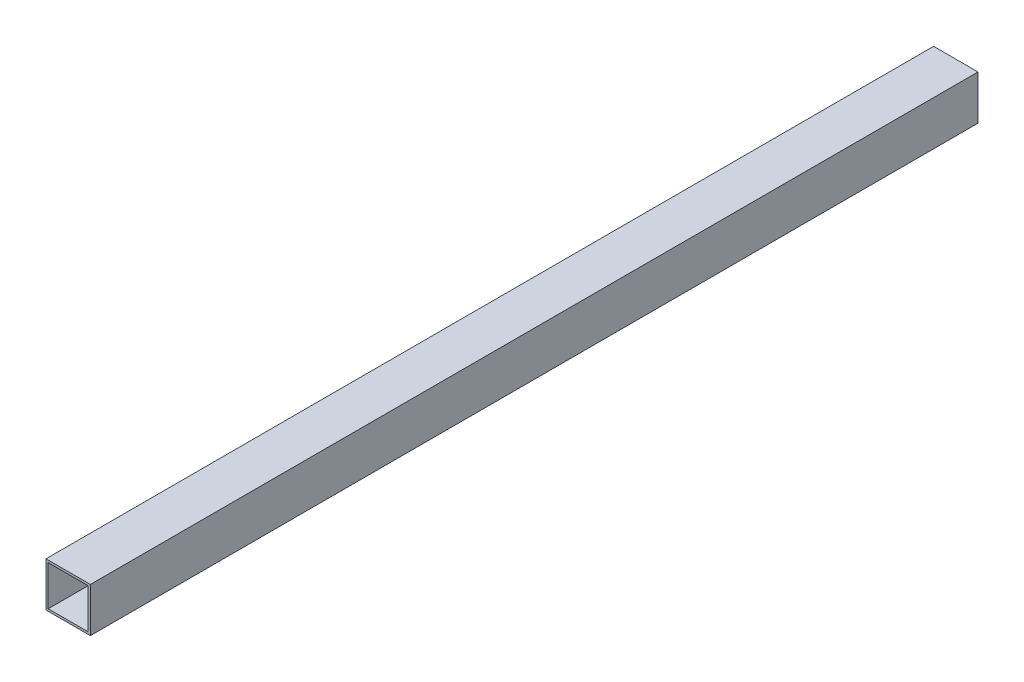
ISO-10303-21;
HEADER;
FILE_DESCRIPTION(('STEP AP214'),'2;1');
FILE_NAME('part.step','',(''),(''),'','','');
FILE_SCHEMA(('AUTOMOTIVE_DESIGN { 1 0 10303 214 1 1 1 1 }'));
ENDSEC;
DATA;
#1=APPLICATION_CONTEXT('core data for automotive mechanical design processes');
#2=APPLICATION_PROTOCOL_DEFINITION('international standard','automotive_design',2000,#1);
#3=PRODUCT_CONTEXT('',#1,'mechanical');
#4=PRODUCT('Part','Part','',(#3));
#5=PRODUCT_RELATED_PRODUCT_CATEGORY('part','',(#4));
#6=PRODUCT_DEFINITION_FORMATION('','',#4);
#7=PRODUCT_DEFINITION_CONTEXT('part definition',#1,'design');
#8=PRODUCT_DEFINITION('design','',#6,#7);
#9=PRODUCT_DEFINITION_SHAPE('','',#8);
#10=(LENGTH_UNIT() NAMED_UNIT(*) SI_UNIT(.MILLI.,.METRE.));
#11=(NAMED_UNIT(*) PLANE_ANGLE_UNIT() SI_UNIT($,.RADIAN.));
#12=(NAMED_UNIT(*) SI_UNIT($,.STERADIAN.) SOLID_ANGLE_UNIT());
#13=UNCERTAINTY_MEASURE_WITH_UNIT(LENGTH_MEASURE(1.E-05),#10,'distance_accuracy_value','');
#14=(GEOMETRIC_REPRESENTATION_CONTEXT(3) GLOBAL_UNCERTAINTY_ASSIGNED_CONTEXT((#13)) GLOBAL_UNIT_ASSIGNED_CONTEXT((#10,
#11,#12)) REPRESENTATION_CONTEXT('',''));
#15=CARTESIAN_POINT('',(0.,0.,0.));
#16=DIRECTION('',(0.,0.,1.));
#17=DIRECTION('',(1.,0.,0.));
#18=AXIS2_PLACEMENT_3D('',#15,#16,#17);
#19=CARTESIAN_POINT('',(-20.,-20.,800.));
#20=DIRECTION('',(0.,0.,1.));
#21=DIRECTION('',(1.,0.,0.));
#22=AXIS2_PLACEMENT_3D('',#19,#20,#21);
#23=PLANE('',#22);
#24=DIRECTION('',(0.,-1.,0.));
#25=VECTOR('',#24,1.);
#26=CARTESIAN_POINT('',(-20.,-20.,800.));
#27=LINE('',#26,#25);
#28=CARTESIAN_POINT('',(-20.,20.,800.));
#29=VERTEX_POINT('',#28);
#30=CARTESIAN_POINT('',(-20.,-20.,800.));
#31=VERTEX_POINT('',#30);
#32=EDGE_CURVE('E155',#29,#31,#27,.T.);
#33=ORIENTED_EDGE('',*,*,#32,.T.);
#34=DIRECTION('',(1.,0.,0.));
#35=VECTOR('',#34,1.);
#36=CARTESIAN_POINT('',(20.,-20.,800.));
#37=LINE('',#36,#35);
#38=CARTESIAN_POINT('',(20.,-20.,800.));
#39=VERTEX_POINT('',#38);
#40=EDGE_CURVE('E158',#31,#39,#37,.T.);
#41=ORIENTED_EDGE('',*,*,#40,.T.);
#42=DIRECTION('',(0.,1.,0.));
#43=VECTOR('',#42,1.);
#44=CARTESIAN_POINT('',(20.,-20.,800.));
#45=LINE('',#44,#43);
#46=CARTESIAN_POINT('',(20.,20.,800.));
#47=VERTEX_POINT('',#46);
#48=EDGE_CURVE('E161',#39,#47,#45,.T.);
#49=ORIENTED_EDGE('',*,*,#48,.T.);
#50=DIRECTION('',(-1.,0.,0.));
#51=VECTOR('',#50,1.);
#52=CARTESIAN_POINT('',(20.,20.,800.));
#53=LINE('',#52,#51);
#54=EDGE_CURVE('E163',#47,#29,#53,.T.);
#55=ORIENTED_EDGE('',*,*,#54,.T.);
#56=EDGE_LOOP('',(#33,#41,#49,#55));
#57=FACE_BOUND('',#56,.T.);
#58=DIRECTION('',(1.,0.,0.));
#59=VECTOR('',#58,1.);
#60=CARTESIAN_POINT('',(20.,-18.,800.));
#61=LINE('',#60,#59);
#62=CARTESIAN_POINT('',(-18.,-18.,800.));
#63=VERTEX_POINT('',#62);
#64=CARTESIAN_POINT('',(18.,-18.,800.));
#65=VERTEX_POINT('',#64);
#66=EDGE_CURVE('E127',#63,#65,#61,.T.);
#67=ORIENTED_EDGE('',*,*,#66,.F.);
#68=DIRECTION('',(0.,-1.,0.));
#69=VECTOR('',#68,1.);
#70=CARTESIAN_POINT('',(-18.,-20.,800.));
#71=LINE('',#70,#69);
#72=CARTESIAN_POINT('',(-18.,18.,800.));
#73=VERTEX_POINT('',#72);
#74=EDGE_CURVE('E119',#73,#63,#71,.T.);
#75=ORIENTED_EDGE('',*,*,#74,.F.);
#76=DIRECTION('',(-1.,0.,0.));
#77=VECTOR('',#76,1.);
#78=CARTESIAN_POINT('',(20.,18.,800.));
#79=LINE('',#78,#77);
#80=CARTESIAN_POINT('',(18.,18.,800.));
#81=VERTEX_POINT('',#80);
#82=EDGE_CURVE('E141',#81,#73,#79,.T.);
#83=ORIENTED_EDGE('',*,*,#82,.F.);
#84=DIRECTION('',(0.,1.,0.));
#85=VECTOR('',#84,1.);
#86=CARTESIAN_POINT('',(18.,-20.,800.));
#87=LINE('',#86,#85);
#88=EDGE_CURVE('E139',#65,#81,#87,.T.);
#89=ORIENTED_EDGE('',*,*,#88,.F.);
#90=EDGE_LOOP('',(#67,#75,#83,#89));
#91=FACE_BOUND('',#90,.T.);
#92=ADVANCED_FACE('F54',(#57,#91),#23,.T.);
#93=CARTESIAN_POINT('',(-20.,-20.,0.));
#94=DIRECTION('',(0.,0.,1.));
#95=DIRECTION('',(1.,0.,0.));
#96=AXIS2_PLACEMENT_3D('',#93,#94,#95);
#97=PLANE('',#96);
#98=DIRECTION('',(0.,-1.,0.));
#99=VECTOR('',#98,1.);
#100=CARTESIAN_POINT('',(-20.,-20.,0.));
#101=LINE('',#100,#99);
#102=CARTESIAN_POINT('',(-20.,20.,0.));
#103=VERTEX_POINT('',#102);
#104=CARTESIAN_POINT('',(-20.,-20.,0.));
#105=VERTEX_POINT('',#104);
#106=EDGE_CURVE('E135',#103,#105,#101,.T.);
#107=ORIENTED_EDGE('',*,*,#106,.F.);
#108=DIRECTION('',(-1.,0.,0.));
#109=VECTOR('',#108,1.);
#110=CARTESIAN_POINT('',(20.,20.,0.));
#111=LINE('',#110,#109);
#112=CARTESIAN_POINT('',(20.,20.,0.));
#113=VERTEX_POINT('',#112);
#114=EDGE_CURVE('E159',#113,#103,#111,.T.);
#115=ORIENTED_EDGE('',*,*,#114,.F.);
#116=DIRECTION('',(0.,1.,0.));
#117=VECTOR('',#116,1.);
#118=CARTESIAN_POINT('',(20.,-20.,0.));
#119=LINE('',#118,#117);
#120=CARTESIAN_POINT('',(20.,-20.,0.));
#121=VERTEX_POINT('',#120);
#122=EDGE_CURVE('E170',#121,#113,#119,.T.);
#123=ORIENTED_EDGE('',*,*,#122,.F.);
#124=DIRECTION('',(1.,0.,0.));
#125=VECTOR('',#124,1.);
#126=CARTESIAN_POINT('',(20.,-20.,0.));
#127=LINE('',#126,#125);
#128=EDGE_CURVE('E168',#105,#121,#127,.T.);
#129=ORIENTED_EDGE('',*,*,#128,.F.);
#130=EDGE_LOOP('',(#107,#115,#123,#129));
#131=FACE_BOUND('',#130,.T.);
#132=DIRECTION('',(0.,-1.,0.));
#133=VECTOR('',#132,1.);
#134=CARTESIAN_POINT('',(-18.,-20.,0.));
#135=LINE('',#134,#133);
#136=CARTESIAN_POINT('',(-18.,18.,0.));
#137=VERTEX_POINT('',#136);
#138=CARTESIAN_POINT('',(-18.,-18.,0.));
#139=VERTEX_POINT('',#138);
#140=EDGE_CURVE('E77',#137,#139,#135,.T.);
#141=ORIENTED_EDGE('',*,*,#140,.T.);
#142=DIRECTION('',(1.,0.,0.));
#143=VECTOR('',#142,1.);
#144=CARTESIAN_POINT('',(20.,-18.,0.));
#145=LINE('',#144,#143);
#146=CARTESIAN_POINT('',(18.,-18.,0.));
#147=VERTEX_POINT('',#146);
#148=EDGE_CURVE('E134',#139,#147,#145,.T.);
#149=ORIENTED_EDGE('',*,*,#148,.T.);
#150=DIRECTION('',(0.,1.,0.));
#151=VECTOR('',#150,1.);
#152=CARTESIAN_POINT('',(18.,-20.,0.));
#153=LINE('',#152,#151);
#154=CARTESIAN_POINT('',(18.,18.,0.));
#155=VERTEX_POINT('',#154);
#156=EDGE_CURVE('E147',#147,#155,#153,.T.);
#157=ORIENTED_EDGE('',*,*,#156,.T.);
#158=DIRECTION('',(-1.,0.,0.));
#159=VECTOR('',#158,1.);
#160=CARTESIAN_POINT('',(20.,18.,0.));
#161=LINE('',#160,#159);
#162=EDGE_CURVE('E128',#155,#137,#161,.T.);
#163=ORIENTED_EDGE('',*,*,#162,.T.);
#164=EDGE_LOOP('',(#141,#149,#157,#163));
#165=FACE_BOUND('',#164,.T.);
#166=ADVANCED_FACE('F188',(#131,#165),#97,.F.);
#167=CARTESIAN_POINT('',(-20.,-20.,800.));
#168=DIRECTION('',(1.,0.,0.));
#169=DIRECTION('',(0.,0.,-1.));
#170=AXIS2_PLACEMENT_3D('',#167,#168,#169);
#171=PLANE('',#170);
#172=ORIENTED_EDGE('',*,*,#106,.T.);
#173=DIRECTION('',(0.,0.,-1.));
#174=VECTOR('',#173,1.);
#175=CARTESIAN_POINT('',(-20.,-20.,800.));
#176=LINE('',#175,#174);
#177=EDGE_CURVE('E12',#31,#105,#176,.T.);
#178=ORIENTED_EDGE('',*,*,#177,.F.);
#179=ORIENTED_EDGE('',*,*,#32,.F.);
#180=DIRECTION('',(0.,0.,-1.));
#181=VECTOR('',#180,1.);
#182=CARTESIAN_POINT('',(-20.,20.,800.));
#183=LINE('',#182,#181);
#184=EDGE_CURVE('E165',#29,#103,#183,.T.);
#185=ORIENTED_EDGE('',*,*,#184,.T.);
#186=EDGE_LOOP('',(#172,#178,#179,#185));
#187=FACE_BOUND('',#186,.T.);
#188=ADVANCED_FACE('F56',(#187),#171,.F.);
#189=CARTESIAN_POINT('',(20.,-20.,800.));
#190=DIRECTION('',(0.,1.,0.));
#191=DIRECTION('',(-1.,0.,0.));
#192=AXIS2_PLACEMENT_3D('',#189,#190,#191);
#193=PLANE('',#192);
#194=ORIENTED_EDGE('',*,*,#128,.T.);
#195=DIRECTION('',(0.,0.,-1.));
#196=VECTOR('',#195,1.);
#197=CARTESIAN_POINT('',(20.,-20.,800.));
#198=LINE('',#197,#196);
#199=EDGE_CURVE('E62',#39,#121,#198,.T.);
#200=ORIENTED_EDGE('',*,*,#199,.F.);
#201=ORIENTED_EDGE('',*,*,#40,.F.);
#202=ORIENTED_EDGE('',*,*,#177,.T.);
#203=EDGE_LOOP('',(#194,#200,#201,#202));
#204=FACE_BOUND('',#203,.T.);
#205=ADVANCED_FACE('F198',(#204),#193,.F.);
#206=CARTESIAN_POINT('',(20.,-20.,800.));
#207=DIRECTION('',(-1.,0.,0.));
#208=DIRECTION('',(0.,0.,1.));
#209=AXIS2_PLACEMENT_3D('',#206,#207,#208);
#210=PLANE('',#209);
#211=ORIENTED_EDGE('',*,*,#122,.T.);
#212=DIRECTION('',(0.,0.,-1.));
#213=VECTOR('',#212,1.);
#214=CARTESIAN_POINT('',(20.,20.,800.));
#215=LINE('',#214,#213);
#216=EDGE_CURVE('E175',#47,#113,#215,.T.);
#217=ORIENTED_EDGE('',*,*,#216,.F.);
#218=ORIENTED_EDGE('',*,*,#48,.F.);
#219=ORIENTED_EDGE('',*,*,#199,.T.);
#220=EDGE_LOOP('',(#211,#217,#218,#219));
#221=FACE_BOUND('',#220,.T.);
#222=ADVANCED_FACE('F182',(#221),#210,.F.);
#223=CARTESIAN_POINT('',(20.,20.,800.));
#224=DIRECTION('',(0.,-1.,0.));
#225=DIRECTION('',(1.,0.,0.));
#226=AXIS2_PLACEMENT_3D('',#223,#224,#225);
#227=PLANE('',#226);
#228=ORIENTED_EDGE('',*,*,#114,.T.);
#229=ORIENTED_EDGE('',*,*,#184,.F.);
#230=ORIENTED_EDGE('',*,*,#54,.F.);
#231=ORIENTED_EDGE('',*,*,#216,.T.);
#232=EDGE_LOOP('',(#228,#229,#230,#231));
#233=FACE_BOUND('',#232,.T.);
#234=ADVANCED_FACE('F192',(#233),#227,.F.);
#235=CARTESIAN_POINT('',(-18.,-20.,800.));
#236=DIRECTION('',(1.,0.,0.));
#237=DIRECTION('',(0.,0.,-1.));
#238=AXIS2_PLACEMENT_3D('',#235,#236,#237);
#239=PLANE('',#238);
#240=ORIENTED_EDGE('',*,*,#140,.F.);
#241=DIRECTION('',(0.,0.,-1.));
#242=VECTOR('',#241,1.);
#243=CARTESIAN_POINT('',(-18.,18.,800.));
#244=LINE('',#243,#242);
#245=EDGE_CURVE('E123',#73,#137,#244,.T.);
#246=ORIENTED_EDGE('',*,*,#245,.F.);
#247=ORIENTED_EDGE('',*,*,#74,.T.);
#248=DIRECTION('',(0.,0.,-1.));
#249=VECTOR('',#248,1.);
#250=CARTESIAN_POINT('',(-18.,-18.,800.));
#251=LINE('',#250,#249);
#252=EDGE_CURVE('E122',#63,#139,#251,.T.);
#253=ORIENTED_EDGE('',*,*,#252,.T.);
#254=EDGE_LOOP('',(#240,#246,#247,#253));
#255=FACE_BOUND('',#254,.T.);
#256=ADVANCED_FACE('F121',(#255),#239,.T.);
#257=CARTESIAN_POINT('',(20.,-18.,800.));
#258=DIRECTION('',(0.,1.,0.));
#259=DIRECTION('',(-1.,0.,0.));
#260=AXIS2_PLACEMENT_3D('',#257,#258,#259);
#261=PLANE('',#260);
#262=ORIENTED_EDGE('',*,*,#148,.F.);
#263=ORIENTED_EDGE('',*,*,#252,.F.);
#264=ORIENTED_EDGE('',*,*,#66,.T.);
#265=DIRECTION('',(0.,0.,-1.));
#266=VECTOR('',#265,1.);
#267=CARTESIAN_POINT('',(18.,-18.,800.));
#268=LINE('',#267,#266);
#269=EDGE_CURVE('E136',#65,#147,#268,.T.);
#270=ORIENTED_EDGE('',*,*,#269,.T.);
#271=EDGE_LOOP('',(#262,#263,#264,#270));
#272=FACE_BOUND('',#271,.T.);
#273=ADVANCED_FACE('F131',(#272),#261,.T.);
#274=CARTESIAN_POINT('',(18.,-20.,800.));
#275=DIRECTION('',(-1.,0.,0.));
#276=DIRECTION('',(0.,0.,1.));
#277=AXIS2_PLACEMENT_3D('',#274,#275,#276);
#278=PLANE('',#277);
#279=ORIENTED_EDGE('',*,*,#156,.F.);
#280=ORIENTED_EDGE('',*,*,#269,.F.);
#281=ORIENTED_EDGE('',*,*,#88,.T.);
#282=DIRECTION('',(0.,0.,-1.));
#283=VECTOR('',#282,1.);
#284=CARTESIAN_POINT('',(18.,18.,800.));
#285=LINE('',#284,#283);
#286=EDGE_CURVE('E69',#81,#155,#285,.T.);
#287=ORIENTED_EDGE('',*,*,#286,.T.);
#288=EDGE_LOOP('',(#279,#280,#281,#287));
#289=FACE_BOUND('',#288,.T.);
#290=ADVANCED_FACE('F221',(#289),#278,.T.);
#291=CARTESIAN_POINT('',(20.,18.,800.));
#292=DIRECTION('',(0.,-1.,0.));
#293=DIRECTION('',(1.,0.,0.));
#294=AXIS2_PLACEMENT_3D('',#291,#292,#293);
#295=PLANE('',#294);
#296=ORIENTED_EDGE('',*,*,#162,.F.);
#297=ORIENTED_EDGE('',*,*,#286,.F.);
#298=ORIENTED_EDGE('',*,*,#82,.T.);
#299=ORIENTED_EDGE('',*,*,#245,.T.);
#300=EDGE_LOOP('',(#296,#297,#298,#299));
#301=FACE_BOUND('',#300,.T.);
#302=ADVANCED_FACE('F225',(#301),#295,.T.);
#303=CLOSED_SHELL('',(#92,#166,#188,#205,#222,#234,#256,#273,#290,#302));
#304=MANIFOLD_SOLID_BREP('B2',#303);
#305=ADVANCED_BREP_SHAPE_REPRESENTATION('',(#18,#304),#14);
#306=SHAPE_DEFINITION_REPRESENTATION(#9,#305);
ENDSEC;
END-ISO-10303-21;
